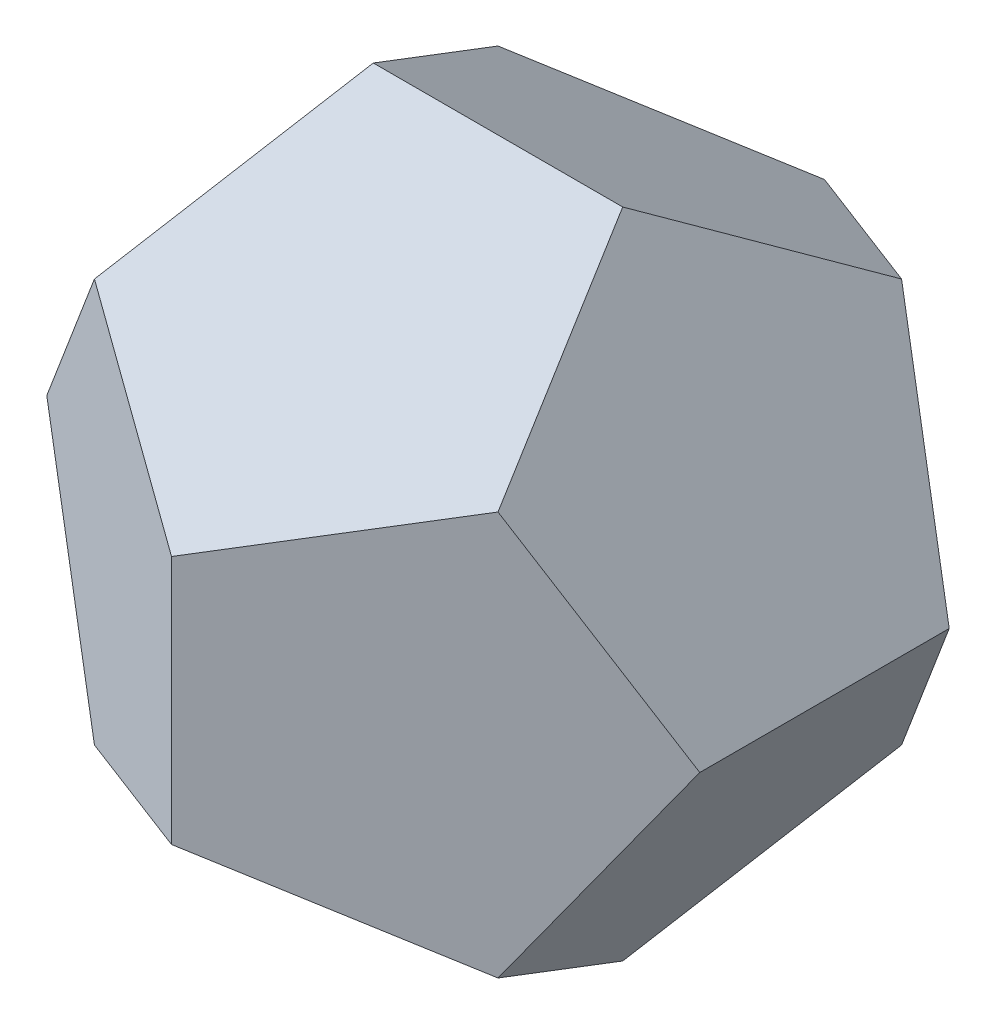
ISO-10303-21;
HEADER;
FILE_DESCRIPTION(('STEP AP214'),'2;1');
FILE_NAME('part.step','',(''),(''),'','','');
FILE_SCHEMA(('AUTOMOTIVE_DESIGN { 1 0 10303 214 1 1 1 1 }'));
ENDSEC;
DATA;
#1=APPLICATION_CONTEXT('core data for automotive mechanical design processes');
#2=APPLICATION_PROTOCOL_DEFINITION('international standard','automotive_design',2000,#1);
#3=PRODUCT_CONTEXT('',#1,'mechanical');
#4=PRODUCT('Part','Part','',(#3));
#5=PRODUCT_RELATED_PRODUCT_CATEGORY('part','',(#4));
#6=PRODUCT_DEFINITION_FORMATION('','',#4);
#7=PRODUCT_DEFINITION_CONTEXT('part definition',#1,'design');
#8=PRODUCT_DEFINITION('design','',#6,#7);
#9=PRODUCT_DEFINITION_SHAPE('','',#8);
#10=(LENGTH_UNIT() NAMED_UNIT(*) SI_UNIT(.MILLI.,.METRE.));
#11=(NAMED_UNIT(*) PLANE_ANGLE_UNIT() SI_UNIT($,.RADIAN.));
#12=(NAMED_UNIT(*) SI_UNIT($,.STERADIAN.) SOLID_ANGLE_UNIT());
#13=UNCERTAINTY_MEASURE_WITH_UNIT(LENGTH_MEASURE(1.E-05),#10,'distance_accuracy_value','');
#14=(GEOMETRIC_REPRESENTATION_CONTEXT(3) GLOBAL_UNCERTAINTY_ASSIGNED_CONTEXT((#13)) GLOBAL_UNIT_ASSIGNED_CONTEXT((#10,
#11,#12)) REPRESENTATION_CONTEXT('',''));
#15=CARTESIAN_POINT('',(0.,0.,0.));
#16=DIRECTION('',(0.,0.,1.));
#17=DIRECTION('',(1.,0.,0.));
#18=AXIS2_PLACEMENT_3D('',#15,#16,#17);
#19=CARTESIAN_POINT('',(-25.,65.4508497187473,0.));
#20=DIRECTION('',(0.85065080835204,-0.525731112119133,0.));
#21=DIRECTION('',(0.525731112119133,0.85065080835204,0.));
#22=AXIS2_PLACEMENT_3D('',#19,#20,#21);
#23=PLANE('',#22);
#24=DIRECTION('',(0.30901699437495,0.499999999999999,0.809016994374947));
#25=VECTOR('',#24,1.);
#26=CARTESIAN_POINT('',(-40.4508497187475,40.4508497187474,-40.4508497187474));
#27=LINE('',#26,#25);
#28=CARTESIAN_POINT('',(-40.4508497187474,40.4508497187475,-40.4508497187473));
#29=VERTEX_POINT('',#28);
#30=CARTESIAN_POINT('',(-25.,65.4508497187473,3.71230823859037E-13));
#31=VERTEX_POINT('',#30);
#32=EDGE_CURVE('E220',#29,#31,#27,.T.);
#33=ORIENTED_EDGE('',*,*,#32,.F.);
#34=DIRECTION('',(0.499999999999999,0.809016994374948,-0.309016994374948));
#35=VECTOR('',#34,1.);
#36=CARTESIAN_POINT('',(-65.4508497187474,0.,-25.));
#37=LINE('',#36,#35);
#38=CARTESIAN_POINT('',(-65.4508497187474,0.,-25.));
#39=VERTEX_POINT('',#38);
#40=EDGE_CURVE('E239',#39,#29,#37,.T.);
#41=ORIENTED_EDGE('',*,*,#40,.F.);
#42=DIRECTION('',(0.,0.,-1.));
#43=VECTOR('',#42,1.);
#44=CARTESIAN_POINT('',(-65.4508497187473,0.,25.));
#45=LINE('',#44,#43);
#46=CARTESIAN_POINT('',(-65.4508497187473,0.,25.));
#47=VERTEX_POINT('',#46);
#48=EDGE_CURVE('E219',#47,#39,#45,.T.);
#49=ORIENTED_EDGE('',*,*,#48,.F.);
#50=DIRECTION('',(-0.500000000000001,-0.809016994374947,-0.309016994374948));
#51=VECTOR('',#50,1.);
#52=CARTESIAN_POINT('',(-40.4508497187473,40.4508497187472,40.4508497187474));
#53=LINE('',#52,#51);
#54=CARTESIAN_POINT('',(-40.4508497187477,40.4508497187471,40.4508497187475));
#55=VERTEX_POINT('',#54);
#56=EDGE_CURVE('E205',#55,#47,#53,.T.);
#57=ORIENTED_EDGE('',*,*,#56,.F.);
#58=DIRECTION('',(-0.309016994374954,-0.500000000000004,0.809016994374942));
#59=VECTOR('',#58,1.);
#60=CARTESIAN_POINT('',(-25.,65.4508497187473,3.71230823859037E-13));
#61=LINE('',#60,#59);
#62=EDGE_CURVE('E605',#31,#55,#61,.T.);
#63=ORIENTED_EDGE('',*,*,#62,.F.);
#64=EDGE_LOOP('',(#33,#41,#49,#57,#63));
#65=FACE_BOUND('',#64,.T.);
#66=ADVANCED_FACE('F46',(#65),#23,.F.);
#67=CARTESIAN_POINT('',(-40.4508497187473,-40.450849718748,-40.4508497187468));
#68=DIRECTION('',(0.,0.850650808352042,0.525731112119131));
#69=DIRECTION('',(-0.951056516295157,0.162459848116443,-0.262865556059562));
#70=AXIS2_PLACEMENT_3D('',#67,#68,#69);
#71=PLANE('',#70);
#72=DIRECTION('',(-0.309016994374957,0.499999999999995,-0.809016994374947));
#73=VECTOR('',#72,1.);
#74=CARTESIAN_POINT('',(-24.9999999999994,-65.4508497187477,5.55111512312578E-13));
#75=LINE('',#74,#73);
#76=CARTESIAN_POINT('',(-24.9999999999996,-65.4508497187474,7.14706072102445E-13));
#77=VERTEX_POINT('',#76);
#78=CARTESIAN_POINT('',(-40.4508497187474,-40.4508497187473,-40.4508497187475));
#79=VERTEX_POINT('',#78);
#80=EDGE_CURVE('E437',#77,#79,#75,.T.);
#81=ORIENTED_EDGE('',*,*,#80,.T.);
#82=DIRECTION('',(0.809016994374942,0.309016994374953,-0.500000000000006));
#83=VECTOR('',#82,1.);
#84=CARTESIAN_POINT('',(-40.4508497187473,-40.450849718748,-40.4508497187468));
#85=LINE('',#84,#83);
#86=CARTESIAN_POINT('',(1.19062915710901E-13,-25.0000000000004,-65.4508497187473));
#87=VERTEX_POINT('',#86);
#88=EDGE_CURVE('E442',#79,#87,#85,.T.);
#89=ORIENTED_EDGE('',*,*,#88,.T.);
#90=DIRECTION('',(-0.809016994374952,0.309016994374937,-0.5));
#91=VECTOR('',#90,1.);
#92=CARTESIAN_POINT('',(40.4508497187477,-40.4508497187472,-40.4508497187473));
#93=LINE('',#92,#91);
#94=CARTESIAN_POINT('',(40.4508497187477,-40.4508497187472,-40.4508497187473));
#95=VERTEX_POINT('',#94);
#96=EDGE_CURVE('E312',#95,#87,#93,.T.);
#97=ORIENTED_EDGE('',*,*,#96,.F.);
#98=DIRECTION('',(-0.309016994374946,-0.500000000000001,0.809016994374947));
#99=VECTOR('',#98,1.);
#100=CARTESIAN_POINT('',(40.4508497187478,-40.4508497187471,-40.4508497187474));
#101=LINE('',#100,#99);
#102=CARTESIAN_POINT('',(25.0000000000006,-65.4508497187472,2.42861286636753E-13));
#103=VERTEX_POINT('',#102);
#104=EDGE_CURVE('E299',#95,#103,#101,.T.);
#105=ORIENTED_EDGE('',*,*,#104,.T.);
#106=DIRECTION('',(1.,0.,0.));
#107=VECTOR('',#106,1.);
#108=CARTESIAN_POINT('',(-24.9999999999996,-65.4508497187474,7.14706072102445E-13));
#109=LINE('',#108,#107);
#110=EDGE_CURVE('E454',#77,#103,#109,.T.);
#111=ORIENTED_EDGE('',*,*,#110,.F.);
#112=EDGE_LOOP('',(#81,#89,#97,#105,#111));
#113=FACE_BOUND('',#112,.T.);
#114=ADVANCED_FACE('F261',(#113),#71,.F.);
#115=CARTESIAN_POINT('',(-24.9999999999999,-65.4508497187474,-2.46111872882229E-13));
#116=DIRECTION('',(0.850650808352039,0.525731112119135,0.));
#117=DIRECTION('',(0.525731112119135,-0.850650808352039,0.));
#118=AXIS2_PLACEMENT_3D('',#115,#116,#117);
#119=PLANE('',#118);
#120=ORIENTED_EDGE('',*,*,#80,.F.);
#121=DIRECTION('',(0.309016994374944,-0.500000000000004,-0.809016994374946));
#122=VECTOR('',#121,1.);
#123=CARTESIAN_POINT('',(-40.4508497187468,-40.4508497187472,40.4508497187481));
#124=LINE('',#123,#122);
#125=CARTESIAN_POINT('',(-40.4508497187468,-40.4508497187472,40.4508497187481));
#126=VERTEX_POINT('',#125);
#127=EDGE_CURVE('E230',#126,#77,#124,.T.);
#128=ORIENTED_EDGE('',*,*,#127,.F.);
#129=DIRECTION('',(-0.500000000000002,0.809016994374947,-0.309016994374944));
#130=VECTOR('',#129,1.);
#131=CARTESIAN_POINT('',(-40.4508497187472,-40.4508497187475,40.4508497187472));
#132=LINE('',#131,#130);
#133=EDGE_CURVE('E210',#126,#47,#132,.T.);
#134=ORIENTED_EDGE('',*,*,#133,.T.);
#135=ORIENTED_EDGE('',*,*,#48,.T.);
#136=DIRECTION('',(0.5,-0.809016994374946,-0.309016994374951));
#137=VECTOR('',#136,1.);
#138=CARTESIAN_POINT('',(-65.4508497187474,0.,-25.));
#139=LINE('',#138,#137);
#140=EDGE_CURVE('E232',#39,#79,#139,.T.);
#141=ORIENTED_EDGE('',*,*,#140,.T.);
#142=EDGE_LOOP('',(#120,#128,#134,#135,#141));
#143=FACE_BOUND('',#142,.T.);
#144=ADVANCED_FACE('F227',(#143),#119,.F.);
#145=CARTESIAN_POINT('',(-4.59592290780615E-13,-25.0000000000008,65.450849718747));
#146=DIRECTION('',(0.525731112119138,0.,-0.850650808352037));
#147=DIRECTION('',(0.688190960235583,-0.58778525229248,0.425325404176017));
#148=AXIS2_PLACEMENT_3D('',#145,#146,#147);
#149=PLANE('',#148);
#150=DIRECTION('',(-0.809016994374949,-0.309016994374955,-0.499999999999992));
#151=VECTOR('',#150,1.);
#152=CARTESIAN_POINT('',(6.72439704547497E-13,-24.9999999999995,65.4508497187477));
#153=LINE('',#152,#151);
#154=CARTESIAN_POINT('',(6.72439704547497E-13,-24.9999999999995,65.4508497187477));
#155=VERTEX_POINT('',#154);
#156=EDGE_CURVE('E385',#155,#126,#153,.T.);
#157=ORIENTED_EDGE('',*,*,#156,.F.);
#158=DIRECTION('',(0.,1.,0.));
#159=VECTOR('',#158,1.);
#160=CARTESIAN_POINT('',(-4.60230727980857E-13,-25.0000000000009,65.450849718747));
#161=LINE('',#160,#159);
#162=CARTESIAN_POINT('',(-4.97865637605344E-13,24.9999999999995,65.4508497187477));
#163=VERTEX_POINT('',#162);
#164=EDGE_CURVE('E233',#155,#163,#161,.T.);
#165=ORIENTED_EDGE('',*,*,#164,.T.);
#166=DIRECTION('',(0.809016994374943,-0.309016994374952,0.500000000000004));
#167=VECTOR('',#166,1.);
#168=CARTESIAN_POINT('',(-40.4508497187477,40.4508497187471,40.4508497187475));
#169=LINE('',#168,#167);
#170=EDGE_CURVE('E147',#55,#163,#169,.T.);
#171=ORIENTED_EDGE('',*,*,#170,.F.);
#172=ORIENTED_EDGE('',*,*,#56,.T.);
#173=ORIENTED_EDGE('',*,*,#133,.F.);
#174=EDGE_LOOP('',(#157,#165,#171,#172,#173));
#175=FACE_BOUND('',#174,.T.);
#176=ADVANCED_FACE('F209',(#175),#149,.F.);
#177=CARTESIAN_POINT('',(2.85018223838452E-13,25.0000000000008,65.450849718747));
#178=DIRECTION('',(-0.525731112119138,0.,-0.850650808352037));
#179=DIRECTION('',(-0.688190960235587,0.587785252292475,0.425325404176017));
#180=AXIS2_PLACEMENT_3D('',#177,#178,#179);
#181=PLANE('',#180);
#182=DIRECTION('',(0.809016994374951,0.309016994374949,-0.499999999999992));
#183=VECTOR('',#182,1.);
#184=CARTESIAN_POINT('',(-4.97865637605344E-13,24.9999999999995,65.4508497187477));
#185=LINE('',#184,#183);
#186=CARTESIAN_POINT('',(40.4508497187471,40.4508497187469,40.4508497187481));
#187=VERTEX_POINT('',#186);
#188=EDGE_CURVE('E631',#163,#187,#185,.T.);
#189=ORIENTED_EDGE('',*,*,#188,.F.);
#190=ORIENTED_EDGE('',*,*,#164,.F.);
#191=DIRECTION('',(-0.809016994374945,0.309016994374947,0.500000000000004));
#192=VECTOR('',#191,1.);
#193=CARTESIAN_POINT('',(40.450849718748,-40.4508497187468,40.4508497187475));
#194=LINE('',#193,#192);
#195=CARTESIAN_POINT('',(40.450849718748,-40.4508497187468,40.4508497187475));
#196=VERTEX_POINT('',#195);
#197=EDGE_CURVE('E376',#196,#155,#194,.T.);
#198=ORIENTED_EDGE('',*,*,#197,.F.);
#199=DIRECTION('',(0.499999999999995,0.80901699437495,-0.309016994374948));
#200=VECTOR('',#199,1.);
#201=CARTESIAN_POINT('',(40.4508497187475,-40.450849718747,40.4508497187474));
#202=LINE('',#201,#200);
#203=CARTESIAN_POINT('',(65.4508497187473,5.54185355463566E-13,25.));
#204=VERTEX_POINT('',#203);
#205=EDGE_CURVE('E303',#196,#204,#202,.T.);
#206=ORIENTED_EDGE('',*,*,#205,.T.);
#207=DIRECTION('',(0.500000000000008,-0.809016994374944,-0.309016994374944));
#208=VECTOR('',#207,1.);
#209=CARTESIAN_POINT('',(40.4508497187469,40.4508497187478,40.4508497187472));
#210=LINE('',#209,#208);
#211=EDGE_CURVE('E601',#187,#204,#210,.T.);
#212=ORIENTED_EDGE('',*,*,#211,.F.);
#213=EDGE_LOOP('',(#189,#190,#198,#206,#212));
#214=FACE_BOUND('',#213,.T.);
#215=ADVANCED_FACE('F406',(#214),#181,.F.);
#216=CARTESIAN_POINT('',(40.4508497187476,40.4508497187477,-40.4508497187468));
#217=DIRECTION('',(0.,-0.850650808352042,0.525731112119131));
#218=DIRECTION('',(0.951056516295156,-0.16245984811645,-0.262865556059562));
#219=AXIS2_PLACEMENT_3D('',#216,#217,#218);
#220=PLANE('',#219);
#221=DIRECTION('',(-0.309016994374954,0.499999999999999,0.809016994374946));
#222=VECTOR('',#221,1.);
#223=CARTESIAN_POINT('',(40.4508497187472,40.4508497187476,-40.4508497187475));
#224=LINE('',#223,#222);
#225=CARTESIAN_POINT('',(40.4508497187468,40.4508497187476,-40.4508497187476));
#226=VERTEX_POINT('',#225);
#227=CARTESIAN_POINT('',(24.9999999999994,65.4508497187476,-2.5432764118662E-13));
#228=VERTEX_POINT('',#227);
#229=EDGE_CURVE('E379',#226,#228,#224,.T.);
#230=ORIENTED_EDGE('',*,*,#229,.F.);
#231=DIRECTION('',(0.809016994374944,0.309016994374958,0.499999999999998));
#232=VECTOR('',#231,1.);
#233=CARTESIAN_POINT('',(-4.5092410646947E-13,24.9999999999997,-65.4508497187475));
#234=LINE('',#233,#232);
#235=CARTESIAN_POINT('',(-4.5092410646947E-13,24.9999999999997,-65.4508497187475));
#236=VERTEX_POINT('',#235);
#237=EDGE_CURVE('E313',#236,#226,#234,.T.);
#238=ORIENTED_EDGE('',*,*,#237,.F.);
#239=DIRECTION('',(-0.809016994374951,0.309016994374944,0.499999999999996));
#240=VECTOR('',#239,1.);
#241=CARTESIAN_POINT('',(3.57353036051222E-13,25.0000000000003,-65.4508497187471));
#242=LINE('',#241,#240);
#243=EDGE_CURVE('E138',#236,#29,#242,.T.);
#244=ORIENTED_EDGE('',*,*,#243,.T.);
#245=ORIENTED_EDGE('',*,*,#32,.T.);
#246=DIRECTION('',(-1.,0.,0.));
#247=VECTOR('',#246,1.);
#248=CARTESIAN_POINT('',(25.,65.4508497187472,7.14706072102445E-13));
#249=LINE('',#248,#247);
#250=EDGE_CURVE('E602',#228,#31,#249,.T.);
#251=ORIENTED_EDGE('',*,*,#250,.F.);
#252=EDGE_LOOP('',(#230,#238,#244,#245,#251));
#253=FACE_BOUND('',#252,.T.);
#254=ADVANCED_FACE('F724',(#253),#220,.F.);
#255=CARTESIAN_POINT('',(40.4508497187471,40.4508497187469,40.4508497187481));
#256=DIRECTION('',(0.,-0.850650808352037,-0.525731112119139));
#257=DIRECTION('',(0.951056516295152,-0.162459848116457,0.262865556059572));
#258=AXIS2_PLACEMENT_3D('',#255,#256,#257);
#259=PLANE('',#258);
#260=ORIENTED_EDGE('',*,*,#188,.T.);
#261=DIRECTION('',(-0.309016994374941,0.500000000000006,-0.809016994374946));
#262=VECTOR('',#261,1.);
#263=CARTESIAN_POINT('',(40.4508497187471,40.4508497187469,40.4508497187481));
#264=LINE('',#263,#262);
#265=EDGE_CURVE('E606',#187,#228,#264,.T.);
#266=ORIENTED_EDGE('',*,*,#265,.T.);
#267=ORIENTED_EDGE('',*,*,#250,.T.);
#268=ORIENTED_EDGE('',*,*,#62,.T.);
#269=ORIENTED_EDGE('',*,*,#170,.T.);
#270=EDGE_LOOP('',(#260,#266,#267,#268,#269));
#271=FACE_BOUND('',#270,.T.);
#272=ADVANCED_FACE('F517',(#271),#259,.F.);
#273=CARTESIAN_POINT('',(24.9999999999995,65.4508497187476,-2.46111872882229E-13));
#274=DIRECTION('',(-0.850650808352036,-0.525731112119141,0.));
#275=DIRECTION('',(-0.525731112119141,0.850650808352036,0.));
#276=AXIS2_PLACEMENT_3D('',#273,#274,#275);
#277=PLANE('',#276);
#278=ORIENTED_EDGE('',*,*,#229,.T.);
#279=ORIENTED_EDGE('',*,*,#265,.F.);
#280=ORIENTED_EDGE('',*,*,#211,.T.);
#281=DIRECTION('',(0.,0.,-1.));
#282=VECTOR('',#281,1.);
#283=CARTESIAN_POINT('',(65.4508497187473,5.54185355463566E-13,25.));
#284=LINE('',#283,#282);
#285=CARTESIAN_POINT('',(65.4508497187474,4.57040840808866E-13,-25.));
#286=VERTEX_POINT('',#285);
#287=EDGE_CURVE('E635',#204,#286,#284,.T.);
#288=ORIENTED_EDGE('',*,*,#287,.T.);
#289=DIRECTION('',(-0.500000000000006,0.809016994374943,-0.309016994374951));
#290=VECTOR('',#289,1.);
#291=CARTESIAN_POINT('',(65.4508497187474,4.57040840808866E-13,-25.));
#292=LINE('',#291,#290);
#293=EDGE_CURVE('E314',#286,#226,#292,.T.);
#294=ORIENTED_EDGE('',*,*,#293,.T.);
#295=EDGE_LOOP('',(#278,#279,#280,#288,#294));
#296=FACE_BOUND('',#295,.T.);
#297=ADVANCED_FACE('F719',(#296),#277,.F.);
#298=CARTESIAN_POINT('',(-40.4508497187468,-40.4508497187472,40.4508497187481));
#299=DIRECTION('',(0.,0.850650808352037,-0.525731112119139));
#300=DIRECTION('',(-0.951056516295153,0.16245984811645,0.262865556059572));
#301=AXIS2_PLACEMENT_3D('',#298,#299,#300);
#302=PLANE('',#301);
#303=ORIENTED_EDGE('',*,*,#156,.T.);
#304=ORIENTED_EDGE('',*,*,#127,.T.);
#305=ORIENTED_EDGE('',*,*,#110,.T.);
#306=DIRECTION('',(0.30901699437495,0.500000000000007,0.809016994374942));
#307=VECTOR('',#306,1.);
#308=CARTESIAN_POINT('',(25.0000000000004,-65.4508497187471,3.71230823859037E-13));
#309=LINE('',#308,#307);
#310=EDGE_CURVE('E380',#103,#196,#309,.T.);
#311=ORIENTED_EDGE('',*,*,#310,.T.);
#312=ORIENTED_EDGE('',*,*,#197,.T.);
#313=EDGE_LOOP('',(#303,#304,#305,#311,#312));
#314=FACE_BOUND('',#313,.T.);
#315=ADVANCED_FACE('F340',(#314),#302,.F.);
#316=CARTESIAN_POINT('',(-4.43346775365321E-13,24.9999999999997,-65.4508497187475));
#317=DIRECTION('',(-0.525731112119133,0.,0.850650808352041));
#318=DIRECTION('',(-0.688190960235594,0.587785252292464,-0.425325404176021));
#319=AXIS2_PLACEMENT_3D('',#316,#317,#318);
#320=PLANE('',#319);
#321=DIRECTION('',(0.,1.,0.));
#322=VECTOR('',#321,1.);
#323=CARTESIAN_POINT('',(1.19062915710901E-13,-25.0000000000004,-65.4508497187473));
#324=LINE('',#323,#322);
#325=EDGE_CURVE('E362',#87,#236,#324,.T.);
#326=ORIENTED_EDGE('',*,*,#325,.T.);
#327=ORIENTED_EDGE('',*,*,#237,.T.);
#328=ORIENTED_EDGE('',*,*,#293,.F.);
#329=DIRECTION('',(-0.499999999999991,-0.809016994374954,-0.309016994374945));
#330=VECTOR('',#329,1.);
#331=CARTESIAN_POINT('',(65.4508497187473,4.98674204232308E-13,-25.0000000000001));
#332=LINE('',#331,#330);
#333=EDGE_CURVE('E308',#286,#95,#332,.T.);
#334=ORIENTED_EDGE('',*,*,#333,.T.);
#335=ORIENTED_EDGE('',*,*,#96,.T.);
#336=EDGE_LOOP('',(#326,#327,#328,#334,#335));
#337=FACE_BOUND('',#336,.T.);
#338=ADVANCED_FACE('F331',(#337),#320,.F.);
#339=CARTESIAN_POINT('',(25.0000000000005,-65.4508497187472,0.));
#340=DIRECTION('',(-0.850650808352044,0.525731112119127,0.));
#341=DIRECTION('',(-0.525731112119127,-0.850650808352044,0.));
#342=AXIS2_PLACEMENT_3D('',#339,#340,#341);
#343=PLANE('',#342);
#344=ORIENTED_EDGE('',*,*,#104,.F.);
#345=ORIENTED_EDGE('',*,*,#333,.F.);
#346=ORIENTED_EDGE('',*,*,#287,.F.);
#347=ORIENTED_EDGE('',*,*,#205,.F.);
#348=ORIENTED_EDGE('',*,*,#310,.F.);
#349=EDGE_LOOP('',(#344,#345,#346,#347,#348));
#350=FACE_BOUND('',#349,.T.);
#351=ADVANCED_FACE('F264',(#350),#343,.F.);
#352=CARTESIAN_POINT('',(2.68772708423166E-13,-24.9999999999997,-65.4508497187475));
#353=DIRECTION('',(0.525731112119133,0.,0.850650808352041));
#354=DIRECTION('',(0.68819096023559,-0.587785252292469,-0.425325404176021));
#355=AXIS2_PLACEMENT_3D('',#352,#353,#354);
#356=PLANE('',#355);
#357=ORIENTED_EDGE('',*,*,#325,.F.);
#358=ORIENTED_EDGE('',*,*,#88,.F.);
#359=ORIENTED_EDGE('',*,*,#140,.F.);
#360=ORIENTED_EDGE('',*,*,#40,.T.);
#361=ORIENTED_EDGE('',*,*,#243,.F.);
#362=EDGE_LOOP('',(#357,#358,#359,#360,#361));
#363=FACE_BOUND('',#362,.T.);
#364=ADVANCED_FACE('F498',(#363),#356,.F.);
#365=CLOSED_SHELL('',(#66,#114,#144,#176,#215,#254,#272,#297,#315,#338,#351,#364));
#366=CARTESIAN_POINT('',(-20.7467459582398,62.8221941581517,0.));
#367=DIRECTION('',(0.85065080835204,-0.525731112119133,0.));
#368=DIRECTION('',(0.525731112119133,0.85065080835204,0.));
#369=AXIS2_PLACEMENT_3D('',#366,#367,#368);
#370=PLANE('',#369);
#371=DIRECTION('',(0.309016994374949,0.499999999999997,0.809016994374949));
#372=VECTOR('',#371,1.);
#373=CARTESIAN_POINT('',(-29.7864985979112,48.195567137272,-18.4090685393597));
#374=LINE('',#373,#372);
#375=CARTESIAN_POINT('',(-36.8181370787206,36.8181370787207,-36.8181370787205));
#376=VERTEX_POINT('',#375);
#377=CARTESIAN_POINT('',(-22.7548601171021,59.5729971958227,2.20630784236881E-13));
#378=VERTEX_POINT('',#377);
#379=EDGE_CURVE('E672',#376,#378,#374,.T.);
#380=ORIENTED_EDGE('',*,*,#379,.T.);
#381=DIRECTION('',(-0.309016994374947,-0.500000000000006,0.809016994374944));
#382=VECTOR('',#381,1.);
#383=CARTESIAN_POINT('',(-29.7864985979115,48.1955671372712,18.409068539361));
#384=LINE('',#383,#382);
#385=CARTESIAN_POINT('',(-36.8181370787206,36.8181370787202,36.8181370787208));
#386=VERTEX_POINT('',#385);
#387=EDGE_CURVE('E683',#378,#386,#384,.T.);
#388=ORIENTED_EDGE('',*,*,#387,.T.);
#389=DIRECTION('',(-0.499999999999999,-0.809016994374944,-0.309016994374957));
#390=VECTOR('',#389,1.);
#391=CARTESIAN_POINT('',(-48.1955671372718,18.4090685393597,29.7864985979112));
#392=LINE('',#391,#390);
#393=CARTESIAN_POINT('',(-59.5729971958226,0.,22.7548601171019));
#394=VERTEX_POINT('',#393);
#395=EDGE_CURVE('E667',#386,#394,#392,.T.);
#396=ORIENTED_EDGE('',*,*,#395,.T.);
#397=DIRECTION('',(0.,0.,-1.));
#398=VECTOR('',#397,1.);
#399=CARTESIAN_POINT('',(-59.5729971958226,0.,0.));
#400=LINE('',#399,#398);
#401=CARTESIAN_POINT('',(-59.5729971958227,0.,-22.7548601171021));
#402=VERTEX_POINT('',#401);
#403=EDGE_CURVE('E131',#394,#402,#400,.T.);
#404=ORIENTED_EDGE('',*,*,#403,.T.);
#405=DIRECTION('',(0.499999999999999,0.809016994374949,-0.309016994374946));
#406=VECTOR('',#405,1.);
#407=CARTESIAN_POINT('',(-48.1955671372715,18.4090685393606,-29.7864985979114));
#408=LINE('',#407,#406);
#409=EDGE_CURVE('E12',#402,#376,#408,.T.);
#410=ORIENTED_EDGE('',*,*,#409,.T.);
#411=EDGE_LOOP('',(#380,#388,#396,#404,#410));
#412=FACE_BOUND('',#411,.T.);
#413=ADVANCED_FACE('F519',(#412),#370,.T.);
#414=CARTESIAN_POINT('',(-40.4508497187473,-36.1975956769878,-37.8221941581512));
#415=DIRECTION('',(0.,0.850650808352042,0.525731112119131));
#416=DIRECTION('',(-0.951056516295157,0.162459848116443,-0.262865556059562));
#417=AXIS2_PLACEMENT_3D('',#414,#415,#416);
#418=PLANE('',#417);
#419=DIRECTION('',(-0.309016994374947,0.499999999999996,-0.80901699437495));
#420=VECTOR('',#419,1.);
#421=CARTESIAN_POINT('',(-37.5119234572847,-35.6955671372721,-38.6344933987335));
#422=LINE('',#421,#420);
#423=CARTESIAN_POINT('',(-22.7548601171019,-59.5729971958228,3.53365539967742E-13));
#424=VERTEX_POINT('',#423);
#425=CARTESIAN_POINT('',(-36.8181370787205,-36.8181370787208,-36.8181370787206));
#426=VERTEX_POINT('',#425);
#427=EDGE_CURVE('E50',#424,#426,#422,.T.);
#428=ORIENTED_EDGE('',*,*,#427,.F.);
#429=DIRECTION('',(1.,0.,0.));
#430=VECTOR('',#429,1.);
#431=CARTESIAN_POINT('',(-40.4508497187468,-59.572997195823,4.02455846426619E-13));
#432=LINE('',#431,#430);
#433=CARTESIAN_POINT('',(22.7548601171025,-59.5729971958225,2.14361345941614E-13));
#434=VERTEX_POINT('',#433);
#435=EDGE_CURVE('E701',#424,#434,#432,.T.);
#436=ORIENTED_EDGE('',*,*,#435,.T.);
#437=DIRECTION('',(-0.309016994374945,-0.499999999999999,0.809016994374949));
#438=VECTOR('',#437,1.);
#439=CARTESIAN_POINT('',(29.7864985979115,-48.1955671372718,-18.4090685393597));
#440=LINE('',#439,#438);
#441=CARTESIAN_POINT('',(36.8181370787209,-36.8181370787204,-36.8181370787205));
#442=VERTEX_POINT('',#441);
#443=EDGE_CURVE('E654',#442,#434,#440,.T.);
#444=ORIENTED_EDGE('',*,*,#443,.F.);
#445=DIRECTION('',(-0.80901699437495,0.30901699437494,-0.5));
#446=VECTOR('',#445,1.);
#447=CARTESIAN_POINT('',(-14.3163563200134,-17.2864985979116,-68.4209919966453));
#448=LINE('',#447,#446);
#449=CARTESIAN_POINT('',(0.,-22.7548601171022,-59.5729971958226));
#450=VERTEX_POINT('',#449);
#451=EDGE_CURVE('E57',#442,#450,#448,.T.);
#452=ORIENTED_EDGE('',*,*,#451,.T.);
#453=DIRECTION('',(0.809016994374947,0.309016994374949,-0.499999999999999));
#454=VECTOR('',#453,1.);
#455=CARTESIAN_POINT('',(-38.6344933987342,-37.5119234572853,-35.6955671372714));
#456=LINE('',#455,#454);
#457=EDGE_CURVE('E650',#426,#450,#456,.T.);
#458=ORIENTED_EDGE('',*,*,#457,.F.);
#459=EDGE_LOOP('',(#428,#436,#444,#452,#458));
#460=FACE_BOUND('',#459,.T.);
#461=ADVANCED_FACE('F929',(#460),#418,.T.);
#462=CARTESIAN_POINT('',(-20.7467459582397,-62.8221941581517,-2.53553777396544E-13));
#463=DIRECTION('',(0.850650808352039,0.525731112119135,0.));
#464=DIRECTION('',(0.525731112119135,-0.850650808352039,0.));
#465=AXIS2_PLACEMENT_3D('',#462,#463,#464);
#466=PLANE('',#465);
#467=ORIENTED_EDGE('',*,*,#427,.T.);
#468=DIRECTION('',(0.500000000000001,-0.809016994374947,-0.309016994374947));
#469=VECTOR('',#468,1.);
#470=CARTESIAN_POINT('',(-27.9701422778979,-51.1344933987341,-42.2864985979113));
#471=LINE('',#470,#469);
#472=EDGE_CURVE('E126',#402,#426,#471,.T.);
#473=ORIENTED_EDGE('',*,*,#472,.F.);
#474=ORIENTED_EDGE('',*,*,#403,.F.);
#475=DIRECTION('',(-0.500000000000002,0.809016994374947,-0.309016994374945));
#476=VECTOR('',#475,1.);
#477=CARTESIAN_POINT('',(-27.9701422778977,-51.1344933987341,42.286498597911));
#478=LINE('',#477,#476);
#479=CARTESIAN_POINT('',(-36.8181370787202,-36.8181370787209,36.8181370787204));
#480=VERTEX_POINT('',#479);
#481=EDGE_CURVE('E657',#480,#394,#478,.T.);
#482=ORIENTED_EDGE('',*,*,#481,.F.);
#483=DIRECTION('',(0.309016994374949,-0.500000000000003,-0.809016994374945));
#484=VECTOR('',#483,1.);
#485=CARTESIAN_POINT('',(-37.511923457285,-35.6955671372715,38.6344933987345));
#486=LINE('',#485,#484);
#487=EDGE_CURVE('E699',#480,#424,#486,.T.);
#488=ORIENTED_EDGE('',*,*,#487,.T.);
#489=EDGE_LOOP('',(#467,#473,#474,#482,#488));
#490=FACE_BOUND('',#489,.T.);
#491=ADVANCED_FACE('F936',(#490),#466,.T.);
#492=CARTESIAN_POINT('',(2.62865556059523,-25.0000000000008,61.1975956769869));
#493=DIRECTION('',(0.525731112119138,0.,-0.850650808352037));
#494=DIRECTION('',(0.688190960235583,-0.58778525229248,0.425325404176017));
#495=AXIS2_PLACEMENT_3D('',#492,#493,#494);
#496=PLANE('',#495);
#497=DIRECTION('',(-0.80901699437494,-0.309016994374961,-0.500000000000004));
#498=VECTOR('',#497,1.);
#499=CARTESIAN_POINT('',(-38.634493398733,-37.5119234572852,35.6955671372718));
#500=LINE('',#499,#498);
#501=CARTESIAN_POINT('',(4.11380247780022E-13,-22.7548601171016,59.5729971958228));
#502=VERTEX_POINT('',#501);
#503=EDGE_CURVE('E697',#502,#480,#500,.T.);
#504=ORIENTED_EDGE('',*,*,#503,.T.);
#505=ORIENTED_EDGE('',*,*,#481,.T.);
#506=ORIENTED_EDGE('',*,*,#395,.F.);
#507=DIRECTION('',(0.809016994374945,-0.309016994374951,0.500000000000001));
#508=VECTOR('',#507,1.);
#509=CARTESIAN_POINT('',(14.3163563200132,17.2864985979108,68.4209919966455));
#510=LINE('',#509,#508);
#511=CARTESIAN_POINT('',(-4.11795816706023E-13,22.7548601171017,59.5729971958228));
#512=VERTEX_POINT('',#511);
#513=EDGE_CURVE('E685',#386,#512,#510,.T.);
#514=ORIENTED_EDGE('',*,*,#513,.T.);
#515=DIRECTION('',(0.,1.,0.));
#516=VECTOR('',#515,1.);
#517=CARTESIAN_POINT('',(4.52329146360952E-13,-25.0000000000009,59.5729971958229));
#518=LINE('',#517,#516);
#519=EDGE_CURVE('E664',#502,#512,#518,.T.);
#520=ORIENTED_EDGE('',*,*,#519,.F.);
#521=EDGE_LOOP('',(#504,#505,#506,#514,#520));
#522=FACE_BOUND('',#521,.T.);
#523=ADVANCED_FACE('F943',(#522),#496,.T.);
#524=CARTESIAN_POINT('',(-2.6286555605954,25.0000000000008,61.1975956769869));
#525=DIRECTION('',(-0.525731112119138,0.,-0.850650808352037));
#526=DIRECTION('',(-0.688190960235587,0.587785252292475,0.425325404176017));
#527=AXIS2_PLACEMENT_3D('',#524,#525,#526);
#528=PLANE('',#527);
#529=DIRECTION('',(0.809016994374941,0.309016994374957,-0.500000000000005));
#530=VECTOR('',#529,1.);
#531=CARTESIAN_POINT('',(38.6344933987331,37.511923457285,35.6955671372716));
#532=LINE('',#531,#530);
#533=CARTESIAN_POINT('',(36.8181370787202,36.8181370787208,36.8181370787202));
#534=VERTEX_POINT('',#533);
#535=EDGE_CURVE('E675',#512,#534,#532,.T.);
#536=ORIENTED_EDGE('',*,*,#535,.T.);
#537=DIRECTION('',(0.500000000000008,-0.809016994374944,-0.309016994374945));
#538=VECTOR('',#537,1.);
#539=CARTESIAN_POINT('',(27.9701422778973,51.1344933987343,42.286498597911));
#540=LINE('',#539,#538);
#541=CARTESIAN_POINT('',(59.5729971958226,5.11160675862453E-13,22.7548601171019));
#542=VERTEX_POINT('',#541);
#543=EDGE_CURVE('E689',#534,#542,#540,.T.);
#544=ORIENTED_EDGE('',*,*,#543,.T.);
#545=DIRECTION('',(0.499999999999993,0.809016994374948,-0.309016994374957));
#546=VECTOR('',#545,1.);
#547=CARTESIAN_POINT('',(48.1955671372719,-18.4090685393594,29.7864985979112));
#548=LINE('',#547,#546);
#549=CARTESIAN_POINT('',(36.8181370787209,-36.81813707872,36.8181370787208));
#550=VERTEX_POINT('',#549);
#551=EDGE_CURVE('E66',#550,#542,#548,.T.);
#552=ORIENTED_EDGE('',*,*,#551,.F.);
#553=DIRECTION('',(-0.809016994374948,0.309016994374945,0.500000000000001));
#554=VECTOR('',#553,1.);
#555=CARTESIAN_POINT('',(-14.316356320013,-17.2864985979109,68.4209919966456));
#556=LINE('',#555,#554);
#557=EDGE_CURVE('E705',#550,#502,#556,.T.);
#558=ORIENTED_EDGE('',*,*,#557,.T.);
#559=ORIENTED_EDGE('',*,*,#519,.T.);
#560=EDGE_LOOP('',(#536,#544,#552,#558,#559));
#561=FACE_BOUND('',#560,.T.);
#562=ADVANCED_FACE('F950',(#561),#528,.T.);
#563=CARTESIAN_POINT('',(40.4508497187476,36.1975956769875,-37.8221941581512));
#564=DIRECTION('',(0.,-0.850650808352042,0.525731112119131));
#565=DIRECTION('',(0.951056516295156,-0.16245984811645,-0.262865556059562));
#566=AXIS2_PLACEMENT_3D('',#563,#564,#565);
#567=PLANE('',#566);
#568=DIRECTION('',(-0.309016994374953,0.499999999999997,0.809016994374947));
#569=VECTOR('',#568,1.);
#570=CARTESIAN_POINT('',(22.0610737385373,60.6955671372714,1.81635632001343));
#571=LINE('',#570,#569);
#572=CARTESIAN_POINT('',(36.8181370787205,36.8181370787206,-36.8181370787205));
#573=VERTEX_POINT('',#572);
#574=CARTESIAN_POINT('',(22.7548601171017,59.5729971958227,3.56470381813525E-13));
#575=VERTEX_POINT('',#574);
#576=EDGE_CURVE('E687',#573,#575,#571,.T.);
#577=ORIENTED_EDGE('',*,*,#576,.T.);
#578=DIRECTION('',(-1.,0.,0.));
#579=VECTOR('',#578,1.);
#580=CARTESIAN_POINT('',(40.4508497187472,59.5729971958227,4.02455846426619E-13));
#581=LINE('',#580,#579);
#582=EDGE_CURVE('E681',#575,#378,#581,.T.);
#583=ORIENTED_EDGE('',*,*,#582,.T.);
#584=ORIENTED_EDGE('',*,*,#379,.F.);
#585=DIRECTION('',(-0.809016994374948,0.309016994374946,0.5));
#586=VECTOR('',#585,1.);
#587=CARTESIAN_POINT('',(14.3163563200134,17.2864985979115,-68.4209919966452));
#588=LINE('',#587,#586);
#589=CARTESIAN_POINT('',(0.,22.7548601171023,-59.5729971958225));
#590=VERTEX_POINT('',#589);
#591=EDGE_CURVE('E670',#590,#376,#588,.T.);
#592=ORIENTED_EDGE('',*,*,#591,.F.);
#593=DIRECTION('',(0.809016994374948,0.309016994374945,0.500000000000001));
#594=VECTOR('',#593,1.);
#595=CARTESIAN_POINT('',(-1.81635632001395,22.0610737385377,-60.6955671372718));
#596=LINE('',#595,#594);
#597=EDGE_CURVE('E709',#590,#573,#596,.T.);
#598=ORIENTED_EDGE('',*,*,#597,.T.);
#599=EDGE_LOOP('',(#577,#583,#584,#592,#598));
#600=FACE_BOUND('',#599,.T.);
#601=ADVANCED_FACE('F958',(#600),#567,.T.);
#602=CARTESIAN_POINT('',(40.4508497187471,36.1975956769868,37.8221941581524));
#603=DIRECTION('',(0.,-0.850650808352037,-0.525731112119139));
#604=DIRECTION('',(0.951056516295152,-0.162459848116457,0.262865556059572));
#605=AXIS2_PLACEMENT_3D('',#602,#603,#604);
#606=PLANE('',#605);
#607=ORIENTED_EDGE('',*,*,#535,.F.);
#608=ORIENTED_EDGE('',*,*,#513,.F.);
#609=ORIENTED_EDGE('',*,*,#387,.F.);
#610=ORIENTED_EDGE('',*,*,#582,.F.);
#611=DIRECTION('',(-0.309016994374954,0.500000000000004,-0.809016994374943));
#612=VECTOR('',#611,1.);
#613=CARTESIAN_POINT('',(37.5119234572851,35.6955671372712,38.6344933987345));
#614=LINE('',#613,#612);
#615=EDGE_CURVE('E678',#534,#575,#614,.T.);
#616=ORIENTED_EDGE('',*,*,#615,.F.);
#617=EDGE_LOOP('',(#607,#608,#609,#610,#616));
#618=FACE_BOUND('',#617,.T.);
#619=ADVANCED_FACE('F965',(#618),#606,.T.);
#620=CARTESIAN_POINT('',(20.7467459582393,62.8221941581519,-2.53553777396544E-13));
#621=DIRECTION('',(-0.850650808352036,-0.525731112119141,0.));
#622=DIRECTION('',(-0.525731112119141,0.850650808352036,0.));
#623=AXIS2_PLACEMENT_3D('',#620,#621,#622);
#624=PLANE('',#623);
#625=ORIENTED_EDGE('',*,*,#576,.F.);
#626=DIRECTION('',(-0.500000000000006,0.809016994374944,-0.309016994374947));
#627=VECTOR('',#626,1.);
#628=CARTESIAN_POINT('',(27.9701422778975,51.1344933987343,-42.2864985979113));
#629=LINE('',#628,#627);
#630=CARTESIAN_POINT('',(59.5729971958227,4.20010964238158E-13,-22.754860117102));
#631=VERTEX_POINT('',#630);
#632=EDGE_CURVE('E694',#631,#573,#629,.T.);
#633=ORIENTED_EDGE('',*,*,#632,.F.);
#634=DIRECTION('',(0.,0.,-1.));
#635=VECTOR('',#634,1.);
#636=CARTESIAN_POINT('',(59.5729971958227,4.57966997657877E-13,0.));
#637=LINE('',#636,#635);
#638=EDGE_CURVE('E691',#542,#631,#637,.T.);
#639=ORIENTED_EDGE('',*,*,#638,.F.);
#640=ORIENTED_EDGE('',*,*,#543,.F.);
#641=ORIENTED_EDGE('',*,*,#615,.T.);
#642=EDGE_LOOP('',(#625,#633,#639,#640,#641));
#643=FACE_BOUND('',#642,.T.);
#644=ADVANCED_FACE('F973',(#643),#624,.T.);
#645=CARTESIAN_POINT('',(-40.4508497187469,-36.197595676987,37.8221941581524));
#646=DIRECTION('',(0.,0.850650808352037,-0.525731112119139));
#647=DIRECTION('',(-0.951056516295153,0.16245984811645,0.262865556059572));
#648=AXIS2_PLACEMENT_3D('',#645,#646,#647);
#649=PLANE('',#648);
#650=ORIENTED_EDGE('',*,*,#503,.F.);
#651=ORIENTED_EDGE('',*,*,#557,.F.);
#652=DIRECTION('',(0.309016994374944,0.500000000000008,0.809016994374944));
#653=VECTOR('',#652,1.);
#654=CARTESIAN_POINT('',(29.7864985979118,-48.195567137271,18.409068539361));
#655=LINE('',#654,#653);
#656=EDGE_CURVE('E703',#434,#550,#655,.T.);
#657=ORIENTED_EDGE('',*,*,#656,.F.);
#658=ORIENTED_EDGE('',*,*,#435,.F.);
#659=ORIENTED_EDGE('',*,*,#487,.F.);
#660=EDGE_LOOP('',(#650,#651,#657,#658,#659));
#661=FACE_BOUND('',#660,.T.);
#662=ADVANCED_FACE('F981',(#661),#649,.T.);
#663=CARTESIAN_POINT('',(-2.62865556059611,24.9999999999996,-61.1975956769873));
#664=DIRECTION('',(-0.525731112119133,0.,0.850650808352041));
#665=DIRECTION('',(-0.688190960235594,0.587785252292464,-0.425325404176021));
#666=AXIS2_PLACEMENT_3D('',#663,#664,#665);
#667=PLANE('',#666);
#668=DIRECTION('',(0.,1.,0.));
#669=VECTOR('',#668,1.);
#670=CARTESIAN_POINT('',(0.,24.9999999999996,-59.5729971958225));
#671=LINE('',#670,#669);
#672=EDGE_CURVE('E707',#450,#590,#671,.T.);
#673=ORIENTED_EDGE('',*,*,#672,.F.);
#674=ORIENTED_EDGE('',*,*,#451,.F.);
#675=DIRECTION('',(-0.499999999999993,-0.809016994374952,-0.309016994374946));
#676=VECTOR('',#675,1.);
#677=CARTESIAN_POINT('',(48.1955671372717,-18.4090685393603,-29.7864985979114));
#678=LINE('',#677,#676);
#679=EDGE_CURVE('E711',#631,#442,#678,.T.);
#680=ORIENTED_EDGE('',*,*,#679,.F.);
#681=ORIENTED_EDGE('',*,*,#632,.T.);
#682=ORIENTED_EDGE('',*,*,#597,.F.);
#683=EDGE_LOOP('',(#673,#674,#680,#681,#682));
#684=FACE_BOUND('',#683,.T.);
#685=ADVANCED_FACE('F989',(#684),#667,.T.);
#686=CARTESIAN_POINT('',(20.7467459582402,-62.8221941581515,0.));
#687=DIRECTION('',(-0.850650808352044,0.525731112119127,0.));
#688=DIRECTION('',(-0.525731112119127,-0.850650808352044,0.));
#689=AXIS2_PLACEMENT_3D('',#686,#687,#688);
#690=PLANE('',#689);
#691=ORIENTED_EDGE('',*,*,#443,.T.);
#692=ORIENTED_EDGE('',*,*,#656,.T.);
#693=ORIENTED_EDGE('',*,*,#551,.T.);
#694=ORIENTED_EDGE('',*,*,#638,.T.);
#695=ORIENTED_EDGE('',*,*,#679,.T.);
#696=EDGE_LOOP('',(#691,#692,#693,#694,#695));
#697=FACE_BOUND('',#696,.T.);
#698=ADVANCED_FACE('F997',(#697),#690,.T.);
#699=CARTESIAN_POINT('',(2.62865556059593,-24.9999999999997,-61.1975956769873));
#700=DIRECTION('',(0.525731112119133,0.,0.850650808352041));
#701=DIRECTION('',(0.68819096023559,-0.587785252292469,-0.425325404176021));
#702=AXIS2_PLACEMENT_3D('',#699,#700,#701);
#703=PLANE('',#702);
#704=ORIENTED_EDGE('',*,*,#672,.T.);
#705=ORIENTED_EDGE('',*,*,#591,.T.);
#706=ORIENTED_EDGE('',*,*,#409,.F.);
#707=ORIENTED_EDGE('',*,*,#472,.T.);
#708=ORIENTED_EDGE('',*,*,#457,.T.);
#709=EDGE_LOOP('',(#704,#705,#706,#707,#708));
#710=FACE_BOUND('',#709,.T.);
#711=ADVANCED_FACE('F48',(#710),#703,.T.);
#712=CLOSED_SHELL('',(#413,#461,#491,#523,#562,#601,#619,#644,#662,#685,#698,#711));
#713=ORIENTED_CLOSED_SHELL('',*,#712,.T.);
#714=BREP_WITH_VOIDS('B2',#365,(#713));
#715=ADVANCED_BREP_SHAPE_REPRESENTATION('',(#18,#714),#14);
#716=SHAPE_DEFINITION_REPRESENTATION(#9,#715);
ENDSEC;
END-ISO-10303-21;
